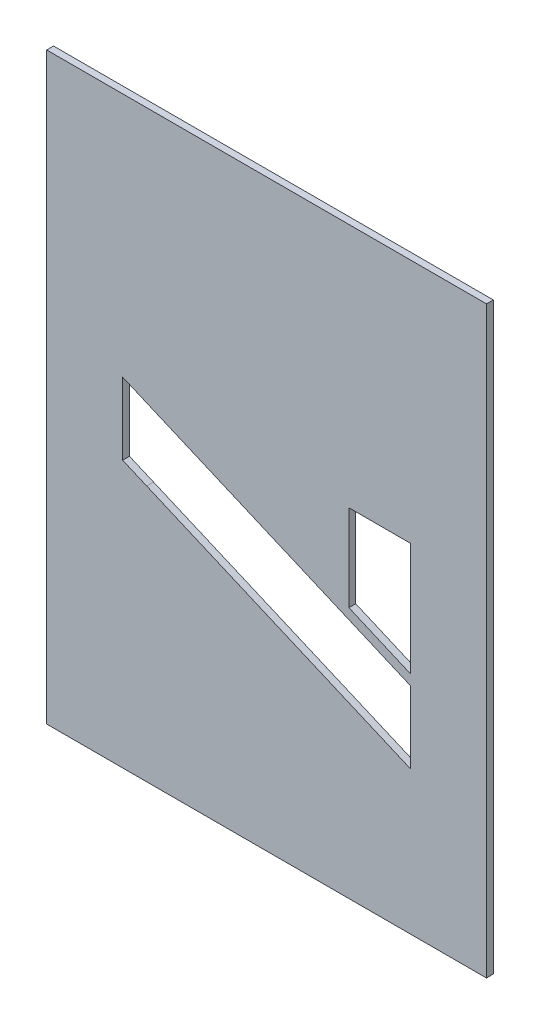
ISO-10303-21;
HEADER;
FILE_DESCRIPTION(('STEP AP214'),'2;1');
FILE_NAME('part.step','',(''),(''),'','','');
FILE_SCHEMA(('AUTOMOTIVE_DESIGN { 1 0 10303 214 1 1 1 1 }'));
ENDSEC;
DATA;
#1=APPLICATION_CONTEXT('core data for automotive mechanical design processes');
#2=APPLICATION_PROTOCOL_DEFINITION('international standard','automotive_design',2000,#1);
#3=PRODUCT_CONTEXT('',#1,'mechanical');
#4=PRODUCT('Part','Part','',(#3));
#5=PRODUCT_RELATED_PRODUCT_CATEGORY('part','',(#4));
#6=PRODUCT_DEFINITION_FORMATION('','',#4);
#7=PRODUCT_DEFINITION_CONTEXT('part definition',#1,'design');
#8=PRODUCT_DEFINITION('design','',#6,#7);
#9=PRODUCT_DEFINITION_SHAPE('','',#8);
#10=(LENGTH_UNIT() NAMED_UNIT(*) SI_UNIT(.MILLI.,.METRE.));
#11=(NAMED_UNIT(*) PLANE_ANGLE_UNIT() SI_UNIT($,.RADIAN.));
#12=(NAMED_UNIT(*) SI_UNIT($,.STERADIAN.) SOLID_ANGLE_UNIT());
#13=UNCERTAINTY_MEASURE_WITH_UNIT(LENGTH_MEASURE(1.E-05),#10,'distance_accuracy_value','');
#14=(GEOMETRIC_REPRESENTATION_CONTEXT(3) GLOBAL_UNCERTAINTY_ASSIGNED_CONTEXT((#13)) GLOBAL_UNIT_ASSIGNED_CONTEXT((#10,
#11,#12)) REPRESENTATION_CONTEXT('',''));
#15=CARTESIAN_POINT('',(0.,0.,0.));
#16=DIRECTION('',(0.,0.,1.));
#17=DIRECTION('',(1.,0.,0.));
#18=AXIS2_PLACEMENT_3D('',#15,#16,#17);
#19=CARTESIAN_POINT('',(-152.75,205.024999999999,-0.00999999999999959));
#20=DIRECTION('',(0.,-1.,0.));
#21=DIRECTION('',(1.,0.,0.));
#22=AXIS2_PLACEMENT_3D('',#19,#20,#21);
#23=PLANE('',#22);
#24=DIRECTION('',(0.,0.,-1.));
#25=VECTOR('',#24,1.);
#26=CARTESIAN_POINT('',(-152.75,205.024999999999,4.75));
#27=LINE('',#26,#25);
#28=CARTESIAN_POINT('',(-152.75,205.024999999999,4.75));
#29=VERTEX_POINT('',#28);
#30=CARTESIAN_POINT('',(-152.75,205.024999999999,0.));
#31=VERTEX_POINT('',#30);
#32=EDGE_CURVE('E162',#29,#31,#27,.T.);
#33=ORIENTED_EDGE('',*,*,#32,.T.);
#34=DIRECTION('',(1.,0.,0.));
#35=VECTOR('',#34,1.);
#36=CARTESIAN_POINT('',(0.,205.024999999999,0.));
#37=LINE('',#36,#35);
#38=CARTESIAN_POINT('',(152.75,205.024999999999,0.));
#39=VERTEX_POINT('',#38);
#40=EDGE_CURVE('E150',#31,#39,#37,.T.);
#41=ORIENTED_EDGE('',*,*,#40,.T.);
#42=DIRECTION('',(0.,0.,1.));
#43=VECTOR('',#42,1.);
#44=CARTESIAN_POINT('',(152.75,205.024999999999,4.75));
#45=LINE('',#44,#43);
#46=CARTESIAN_POINT('',(152.75,205.024999999999,4.75));
#47=VERTEX_POINT('',#46);
#48=EDGE_CURVE('E160',#39,#47,#45,.T.);
#49=ORIENTED_EDGE('',*,*,#48,.T.);
#50=DIRECTION('',(1.,0.,0.));
#51=VECTOR('',#50,1.);
#52=CARTESIAN_POINT('',(0.,205.024999999999,4.75));
#53=LINE('',#52,#51);
#54=EDGE_CURVE('E163',#29,#47,#53,.T.);
#55=ORIENTED_EDGE('',*,*,#54,.F.);
#56=EDGE_LOOP('',(#33,#41,#49,#55));
#57=FACE_BOUND('',#56,.T.);
#58=ADVANCED_FACE('F35',(#57),#23,.T.);
#59=CARTESIAN_POINT('',(0.,0.,4.75));
#60=DIRECTION('',(0.,0.,1.));
#61=DIRECTION('',(1.,0.,0.));
#62=AXIS2_PLACEMENT_3D('',#59,#60,#61);
#63=PLANE('',#62);
#64=DIRECTION('',(0.,-1.,0.));
#65=VECTOR('',#64,1.);
#66=CARTESIAN_POINT('',(100.025,440.126984126983,4.75));
#67=LINE('',#66,#65);
#68=CARTESIAN_POINT('',(100.025,440.126984126983,4.75));
#69=VERTEX_POINT('',#68);
#70=CARTESIAN_POINT('',(100.025,361.566137566137,4.75));
#71=VERTEX_POINT('',#70);
#72=EDGE_CURVE('E239',#69,#71,#67,.T.);
#73=ORIENTED_EDGE('',*,*,#72,.T.);
#74=DIRECTION('',(-0.918392323076319,0.395671000851062,0.));
#75=VECTOR('',#74,1.);
#76=CARTESIAN_POINT('',(100.025,361.566137566137,4.75));
#77=LINE('',#76,#75);
#78=CARTESIAN_POINT('',(57.1890211640211,380.021164021163,4.75));
#79=VERTEX_POINT('',#78);
#80=EDGE_CURVE('E11',#71,#79,#77,.T.);
#81=ORIENTED_EDGE('',*,*,#80,.T.);
#82=DIRECTION('',(0.,1.,0.));
#83=VECTOR('',#82,1.);
#84=CARTESIAN_POINT('',(57.1890211640211,380.021164021163,4.75));
#85=LINE('',#84,#83);
#86=CARTESIAN_POINT('',(57.1890211640211,440.126984126983,4.75));
#87=VERTEX_POINT('',#86);
#88=EDGE_CURVE('E45',#79,#87,#85,.T.);
#89=ORIENTED_EDGE('',*,*,#88,.T.);
#90=DIRECTION('',(1.,0.,0.));
#91=VECTOR('',#90,1.);
#92=CARTESIAN_POINT('',(57.1890211640211,440.126984126983,4.75));
#93=LINE('',#92,#91);
#94=EDGE_CURVE('E242',#87,#69,#93,.T.);
#95=ORIENTED_EDGE('',*,*,#94,.T.);
#96=EDGE_LOOP('',(#73,#81,#89,#95));
#97=FACE_BOUND('',#96,.T.);
#98=DIRECTION('',(0.919123069768513,-0.393970535217173,0.));
#99=VECTOR('',#98,1.);
#100=CARTESIAN_POINT('',(-99.9750000000001,440.126984126983,4.75));
#101=LINE('',#100,#99);
#102=CARTESIAN_POINT('',(-99.9750000000001,440.126984126983,4.75));
#103=VERTEX_POINT('',#102);
#104=CARTESIAN_POINT('',(83.3054232804232,361.566137566137,4.75));
#105=VERTEX_POINT('',#104);
#106=EDGE_CURVE('E200',#103,#105,#101,.T.);
#107=ORIENTED_EDGE('',*,*,#106,.T.);
#108=DIRECTION('',(0.91938564023369,-0.393357400505046,0.));
#109=VECTOR('',#108,1.);
#110=CARTESIAN_POINT('',(83.3054232804232,361.566137566137,4.75));
#111=LINE('',#110,#109);
#112=CARTESIAN_POINT('',(100.025,354.412698412697,4.75));
#113=VERTEX_POINT('',#112);
#114=EDGE_CURVE('E216',#105,#113,#111,.T.);
#115=ORIENTED_EDGE('',*,*,#114,.T.);
#116=DIRECTION('',(0.,-1.,0.));
#117=VECTOR('',#116,1.);
#118=CARTESIAN_POINT('',(100.025,354.412698412697,4.75));
#119=LINE('',#118,#117);
#120=CARTESIAN_POINT('',(100.025,304.423280423279,4.75));
#121=VERTEX_POINT('',#120);
#122=EDGE_CURVE('E213',#113,#121,#119,.T.);
#123=ORIENTED_EDGE('',*,*,#122,.T.);
#124=DIRECTION('',(-0.919123069768513,0.393970535217173,0.));
#125=VECTOR('',#124,1.);
#126=CARTESIAN_POINT('',(100.025,304.423280423279,4.75));
#127=LINE('',#126,#125);
#128=CARTESIAN_POINT('',(-83.2554232804233,382.984126984126,4.75));
#129=VERTEX_POINT('',#128);
#130=EDGE_CURVE('E210',#121,#129,#127,.T.);
#131=ORIENTED_EDGE('',*,*,#130,.T.);
#132=DIRECTION('',(-0.91938564023369,0.393357400505046,0.));
#133=VECTOR('',#132,1.);
#134=CARTESIAN_POINT('',(-83.2554232804233,382.984126984126,4.75));
#135=LINE('',#134,#133);
#136=CARTESIAN_POINT('',(-99.9750000000001,390.137566137565,4.75));
#137=VERTEX_POINT('',#136);
#138=EDGE_CURVE('E207',#129,#137,#135,.T.);
#139=ORIENTED_EDGE('',*,*,#138,.T.);
#140=DIRECTION('',(0.,1.,0.));
#141=VECTOR('',#140,1.);
#142=CARTESIAN_POINT('',(-99.9750000000001,390.137566137565,4.75));
#143=LINE('',#142,#141);
#144=EDGE_CURVE('E203',#137,#103,#143,.T.);
#145=ORIENTED_EDGE('',*,*,#144,.T.);
#146=EDGE_LOOP('',(#107,#115,#123,#131,#139,#145));
#147=FACE_BOUND('',#146,.T.);
#148=DIRECTION('',(0.,-1.,0.));
#149=VECTOR('',#148,1.);
#150=CARTESIAN_POINT('',(-152.75,-610.575000000001,4.75));
#151=LINE('',#150,#149);
#152=CARTESIAN_POINT('',(-152.75,610.574999999999,4.75));
#153=VERTEX_POINT('',#152);
#154=EDGE_CURVE('E172',#153,#29,#151,.T.);
#155=ORIENTED_EDGE('',*,*,#154,.T.);
#156=ORIENTED_EDGE('',*,*,#54,.T.);
#157=DIRECTION('',(0.,1.,0.));
#158=VECTOR('',#157,1.);
#159=CARTESIAN_POINT('',(152.75,-610.575000000001,4.75));
#160=LINE('',#159,#158);
#161=CARTESIAN_POINT('',(152.75,610.574999999999,4.75));
#162=VERTEX_POINT('',#161);
#163=EDGE_CURVE('E166',#47,#162,#160,.T.);
#164=ORIENTED_EDGE('',*,*,#163,.T.);
#165=DIRECTION('',(-1.,0.,0.));
#166=VECTOR('',#165,1.);
#167=CARTESIAN_POINT('',(152.75,610.574999999999,4.75));
#168=LINE('',#167,#166);
#169=EDGE_CURVE('E173',#162,#153,#168,.T.);
#170=ORIENTED_EDGE('',*,*,#169,.T.);
#171=EDGE_LOOP('',(#155,#156,#164,#170));
#172=FACE_BOUND('',#171,.T.);
#173=ADVANCED_FACE('F255',(#97,#147,#172),#63,.T.);
#174=CARTESIAN_POINT('',(0.,0.,0.));
#175=DIRECTION('',(0.,0.,1.));
#176=DIRECTION('',(1.,0.,0.));
#177=AXIS2_PLACEMENT_3D('',#174,#175,#176);
#178=PLANE('',#177);
#179=DIRECTION('',(0.91938564023369,-0.393357400505046,0.));
#180=VECTOR('',#179,1.);
#181=CARTESIAN_POINT('',(83.3054232804232,361.566137566137,0.));
#182=LINE('',#181,#180);
#183=CARTESIAN_POINT('',(83.3054232804232,361.566137566137,0.));
#184=VERTEX_POINT('',#183);
#185=CARTESIAN_POINT('',(100.025,354.412698412697,0.));
#186=VERTEX_POINT('',#185);
#187=EDGE_CURVE('E204',#184,#186,#182,.T.);
#188=ORIENTED_EDGE('',*,*,#187,.F.);
#189=DIRECTION('',(0.919123069768513,-0.393970535217173,0.));
#190=VECTOR('',#189,1.);
#191=CARTESIAN_POINT('',(-99.9750000000001,440.126984126983,0.));
#192=LINE('',#191,#190);
#193=CARTESIAN_POINT('',(-99.9750000000001,440.126984126983,0.));
#194=VERTEX_POINT('',#193);
#195=EDGE_CURVE('E199',#194,#184,#192,.T.);
#196=ORIENTED_EDGE('',*,*,#195,.F.);
#197=DIRECTION('',(0.,1.,0.));
#198=VECTOR('',#197,1.);
#199=CARTESIAN_POINT('',(-99.9750000000001,390.137566137565,0.));
#200=LINE('',#199,#198);
#201=CARTESIAN_POINT('',(-99.9750000000001,390.137566137565,0.));
#202=VERTEX_POINT('',#201);
#203=EDGE_CURVE('E221',#202,#194,#200,.T.);
#204=ORIENTED_EDGE('',*,*,#203,.F.);
#205=DIRECTION('',(-0.91938564023369,0.393357400505046,0.));
#206=VECTOR('',#205,1.);
#207=CARTESIAN_POINT('',(-83.2554232804233,382.984126984126,0.));
#208=LINE('',#207,#206);
#209=CARTESIAN_POINT('',(-83.2554232804233,382.984126984126,0.));
#210=VERTEX_POINT('',#209);
#211=EDGE_CURVE('E224',#210,#202,#208,.T.);
#212=ORIENTED_EDGE('',*,*,#211,.F.);
#213=DIRECTION('',(-0.919123069768513,0.393970535217173,0.));
#214=VECTOR('',#213,1.);
#215=CARTESIAN_POINT('',(100.025,304.423280423279,0.));
#216=LINE('',#215,#214);
#217=CARTESIAN_POINT('',(100.025,304.423280423279,0.));
#218=VERTEX_POINT('',#217);
#219=EDGE_CURVE('E226',#218,#210,#216,.T.);
#220=ORIENTED_EDGE('',*,*,#219,.F.);
#221=DIRECTION('',(0.,-1.,0.));
#222=VECTOR('',#221,1.);
#223=CARTESIAN_POINT('',(100.025,354.412698412697,0.));
#224=LINE('',#223,#222);
#225=EDGE_CURVE('E228',#186,#218,#224,.T.);
#226=ORIENTED_EDGE('',*,*,#225,.F.);
#227=EDGE_LOOP('',(#188,#196,#204,#212,#220,#226));
#228=FACE_BOUND('',#227,.T.);
#229=DIRECTION('',(-0.918392323076319,0.395671000851062,0.));
#230=VECTOR('',#229,1.);
#231=CARTESIAN_POINT('',(100.025,361.566137566137,0.));
#232=LINE('',#231,#230);
#233=CARTESIAN_POINT('',(100.025,361.566137566137,0.));
#234=VERTEX_POINT('',#233);
#235=CARTESIAN_POINT('',(57.1890211640211,380.021164021163,0.));
#236=VERTEX_POINT('',#235);
#237=EDGE_CURVE('E71',#234,#236,#232,.T.);
#238=ORIENTED_EDGE('',*,*,#237,.F.);
#239=DIRECTION('',(0.,-1.,0.));
#240=VECTOR('',#239,1.);
#241=CARTESIAN_POINT('',(100.025,440.126984126983,0.));
#242=LINE('',#241,#240);
#243=CARTESIAN_POINT('',(100.025,440.126984126983,0.));
#244=VERTEX_POINT('',#243);
#245=EDGE_CURVE('E238',#244,#234,#242,.T.);
#246=ORIENTED_EDGE('',*,*,#245,.F.);
#247=DIRECTION('',(1.,0.,0.));
#248=VECTOR('',#247,1.);
#249=CARTESIAN_POINT('',(57.1890211640211,440.126984126983,0.));
#250=LINE('',#249,#248);
#251=CARTESIAN_POINT('',(57.1890211640211,440.126984126983,0.));
#252=VERTEX_POINT('',#251);
#253=EDGE_CURVE('E247',#252,#244,#250,.T.);
#254=ORIENTED_EDGE('',*,*,#253,.F.);
#255=DIRECTION('',(0.,1.,0.));
#256=VECTOR('',#255,1.);
#257=CARTESIAN_POINT('',(57.1890211640211,380.021164021163,0.));
#258=LINE('',#257,#256);
#259=EDGE_CURVE('E65',#236,#252,#258,.T.);
#260=ORIENTED_EDGE('',*,*,#259,.F.);
#261=EDGE_LOOP('',(#238,#246,#254,#260));
#262=FACE_BOUND('',#261,.T.);
#263=ORIENTED_EDGE('',*,*,#40,.F.);
#264=DIRECTION('',(0.,-1.,0.));
#265=VECTOR('',#264,1.);
#266=CARTESIAN_POINT('',(-152.75,-610.575000000001,0.));
#267=LINE('',#266,#265);
#268=CARTESIAN_POINT('',(-152.75,610.574999999999,0.));
#269=VERTEX_POINT('',#268);
#270=EDGE_CURVE('E39',#269,#31,#267,.T.);
#271=ORIENTED_EDGE('',*,*,#270,.F.);
#272=DIRECTION('',(-1.,0.,0.));
#273=VECTOR('',#272,1.);
#274=CARTESIAN_POINT('',(152.75,610.574999999999,0.));
#275=LINE('',#274,#273);
#276=CARTESIAN_POINT('',(152.75,610.574999999999,0.));
#277=VERTEX_POINT('',#276);
#278=EDGE_CURVE('E152',#277,#269,#275,.T.);
#279=ORIENTED_EDGE('',*,*,#278,.F.);
#280=DIRECTION('',(0.,1.,0.));
#281=VECTOR('',#280,1.);
#282=CARTESIAN_POINT('',(152.75,-610.575000000001,0.));
#283=LINE('',#282,#281);
#284=EDGE_CURVE('E146',#39,#277,#283,.T.);
#285=ORIENTED_EDGE('',*,*,#284,.F.);
#286=EDGE_LOOP('',(#263,#271,#279,#285));
#287=FACE_BOUND('',#286,.T.);
#288=ADVANCED_FACE('F148',(#228,#262,#287),#178,.F.);
#289=CARTESIAN_POINT('',(-152.75,-610.575000000001,4.75));
#290=DIRECTION('',(1.,0.,0.));
#291=DIRECTION('',(0.,0.,-1.));
#292=AXIS2_PLACEMENT_3D('',#289,#290,#291);
#293=PLANE('',#292);
#294=ORIENTED_EDGE('',*,*,#32,.F.);
#295=ORIENTED_EDGE('',*,*,#154,.F.);
#296=DIRECTION('',(0.,0.,-1.));
#297=VECTOR('',#296,1.);
#298=CARTESIAN_POINT('',(-152.75,610.574999999999,4.75));
#299=LINE('',#298,#297);
#300=EDGE_CURVE('E182',#153,#269,#299,.T.);
#301=ORIENTED_EDGE('',*,*,#300,.T.);
#302=ORIENTED_EDGE('',*,*,#270,.T.);
#303=EDGE_LOOP('',(#294,#295,#301,#302));
#304=FACE_BOUND('',#303,.T.);
#305=ADVANCED_FACE('F37',(#304),#293,.F.);
#306=CARTESIAN_POINT('',(152.75,-610.575000000001,4.75));
#307=DIRECTION('',(-1.,0.,0.));
#308=DIRECTION('',(0.,0.,1.));
#309=AXIS2_PLACEMENT_3D('',#306,#307,#308);
#310=PLANE('',#309);
#311=ORIENTED_EDGE('',*,*,#48,.F.);
#312=ORIENTED_EDGE('',*,*,#284,.T.);
#313=DIRECTION('',(0.,0.,-1.));
#314=VECTOR('',#313,1.);
#315=CARTESIAN_POINT('',(152.75,610.574999999999,4.75));
#316=LINE('',#315,#314);
#317=EDGE_CURVE('E251',#162,#277,#316,.T.);
#318=ORIENTED_EDGE('',*,*,#317,.F.);
#319=ORIENTED_EDGE('',*,*,#163,.F.);
#320=EDGE_LOOP('',(#311,#312,#318,#319));
#321=FACE_BOUND('',#320,.T.);
#322=ADVANCED_FACE('F165',(#321),#310,.F.);
#323=CARTESIAN_POINT('',(152.75,610.574999999999,4.75));
#324=DIRECTION('',(0.,-1.,0.));
#325=DIRECTION('',(1.,0.,0.));
#326=AXIS2_PLACEMENT_3D('',#323,#324,#325);
#327=PLANE('',#326);
#328=ORIENTED_EDGE('',*,*,#278,.T.);
#329=ORIENTED_EDGE('',*,*,#300,.F.);
#330=ORIENTED_EDGE('',*,*,#169,.F.);
#331=ORIENTED_EDGE('',*,*,#317,.T.);
#332=EDGE_LOOP('',(#328,#329,#330,#331));
#333=FACE_BOUND('',#332,.T.);
#334=ADVANCED_FACE('F254',(#333),#327,.F.);
#335=CARTESIAN_POINT('',(83.3054232804232,361.566137566137,0.));
#336=DIRECTION('',(-0.393357400505046,-0.91938564023369,0.));
#337=DIRECTION('',(0.91938564023369,-0.393357400505046,0.));
#338=AXIS2_PLACEMENT_3D('',#335,#336,#337);
#339=PLANE('',#338);
#340=ORIENTED_EDGE('',*,*,#114,.F.);
#341=DIRECTION('',(0.,0.,1.));
#342=VECTOR('',#341,1.);
#343=CARTESIAN_POINT('',(83.3054232804232,361.566137566137,0.));
#344=LINE('',#343,#342);
#345=EDGE_CURVE('E196',#184,#105,#344,.T.);
#346=ORIENTED_EDGE('',*,*,#345,.F.);
#347=ORIENTED_EDGE('',*,*,#187,.T.);
#348=DIRECTION('',(0.,0.,1.));
#349=VECTOR('',#348,1.);
#350=CARTESIAN_POINT('',(100.025,354.412698412697,0.));
#351=LINE('',#350,#349);
#352=EDGE_CURVE('E185',#186,#113,#351,.T.);
#353=ORIENTED_EDGE('',*,*,#352,.T.);
#354=EDGE_LOOP('',(#340,#346,#347,#353));
#355=FACE_BOUND('',#354,.T.);
#356=ADVANCED_FACE('F274',(#355),#339,.T.);
#357=CARTESIAN_POINT('',(100.025,354.412698412697,0.));
#358=DIRECTION('',(-1.,0.,0.));
#359=DIRECTION('',(0.,0.,1.));
#360=AXIS2_PLACEMENT_3D('',#357,#358,#359);
#361=PLANE('',#360);
#362=ORIENTED_EDGE('',*,*,#122,.F.);
#363=ORIENTED_EDGE('',*,*,#352,.F.);
#364=ORIENTED_EDGE('',*,*,#225,.T.);
#365=DIRECTION('',(0.,0.,1.));
#366=VECTOR('',#365,1.);
#367=CARTESIAN_POINT('',(100.025,304.423280423279,0.));
#368=LINE('',#367,#366);
#369=EDGE_CURVE('E188',#218,#121,#368,.T.);
#370=ORIENTED_EDGE('',*,*,#369,.T.);
#371=EDGE_LOOP('',(#362,#363,#364,#370));
#372=FACE_BOUND('',#371,.T.);
#373=ADVANCED_FACE('F361',(#372),#361,.T.);
#374=CARTESIAN_POINT('',(100.025,304.423280423279,0.));
#375=DIRECTION('',(0.393970535217173,0.919123069768513,0.));
#376=DIRECTION('',(-0.919123069768513,0.393970535217173,0.));
#377=AXIS2_PLACEMENT_3D('',#374,#375,#376);
#378=PLANE('',#377);
#379=ORIENTED_EDGE('',*,*,#130,.F.);
#380=ORIENTED_EDGE('',*,*,#369,.F.);
#381=ORIENTED_EDGE('',*,*,#219,.T.);
#382=DIRECTION('',(0.,0.,1.));
#383=VECTOR('',#382,1.);
#384=CARTESIAN_POINT('',(-83.2554232804233,382.984126984126,0.));
#385=LINE('',#384,#383);
#386=EDGE_CURVE('E190',#210,#129,#385,.T.);
#387=ORIENTED_EDGE('',*,*,#386,.T.);
#388=EDGE_LOOP('',(#379,#380,#381,#387));
#389=FACE_BOUND('',#388,.T.);
#390=ADVANCED_FACE('F352',(#389),#378,.T.);
#391=CARTESIAN_POINT('',(-83.2554232804233,382.984126984126,0.));
#392=DIRECTION('',(0.393357400505046,0.91938564023369,0.));
#393=DIRECTION('',(-0.91938564023369,0.393357400505046,0.));
#394=AXIS2_PLACEMENT_3D('',#391,#392,#393);
#395=PLANE('',#394);
#396=ORIENTED_EDGE('',*,*,#138,.F.);
#397=ORIENTED_EDGE('',*,*,#386,.F.);
#398=ORIENTED_EDGE('',*,*,#211,.T.);
#399=DIRECTION('',(0.,0.,1.));
#400=VECTOR('',#399,1.);
#401=CARTESIAN_POINT('',(-99.9750000000001,390.137566137565,0.));
#402=LINE('',#401,#400);
#403=EDGE_CURVE('E192',#202,#137,#402,.T.);
#404=ORIENTED_EDGE('',*,*,#403,.T.);
#405=EDGE_LOOP('',(#396,#397,#398,#404));
#406=FACE_BOUND('',#405,.T.);
#407=ADVANCED_FACE('F343',(#406),#395,.T.);
#408=CARTESIAN_POINT('',(-99.9750000000001,390.137566137565,0.));
#409=DIRECTION('',(1.,0.,0.));
#410=DIRECTION('',(0.,0.,-1.));
#411=AXIS2_PLACEMENT_3D('',#408,#409,#410);
#412=PLANE('',#411);
#413=ORIENTED_EDGE('',*,*,#144,.F.);
#414=ORIENTED_EDGE('',*,*,#403,.F.);
#415=ORIENTED_EDGE('',*,*,#203,.T.);
#416=DIRECTION('',(0.,0.,1.));
#417=VECTOR('',#416,1.);
#418=CARTESIAN_POINT('',(-99.9750000000001,440.126984126983,0.));
#419=LINE('',#418,#417);
#420=EDGE_CURVE('E194',#194,#103,#419,.T.);
#421=ORIENTED_EDGE('',*,*,#420,.T.);
#422=EDGE_LOOP('',(#413,#414,#415,#421));
#423=FACE_BOUND('',#422,.T.);
#424=ADVANCED_FACE('F334',(#423),#412,.T.);
#425=CARTESIAN_POINT('',(-99.9750000000001,440.126984126983,0.));
#426=DIRECTION('',(-0.393970535217173,-0.919123069768513,0.));
#427=DIRECTION('',(0.919123069768513,-0.393970535217173,0.));
#428=AXIS2_PLACEMENT_3D('',#425,#426,#427);
#429=PLANE('',#428);
#430=ORIENTED_EDGE('',*,*,#106,.F.);
#431=ORIENTED_EDGE('',*,*,#420,.F.);
#432=ORIENTED_EDGE('',*,*,#195,.T.);
#433=ORIENTED_EDGE('',*,*,#345,.T.);
#434=EDGE_LOOP('',(#430,#431,#432,#433));
#435=FACE_BOUND('',#434,.T.);
#436=ADVANCED_FACE('F326',(#435),#429,.T.);
#437=CARTESIAN_POINT('',(100.025,361.566137566137,0.));
#438=DIRECTION('',(0.395671000851062,0.918392323076319,0.));
#439=DIRECTION('',(-0.91839232307632,0.395671000851062,0.));
#440=AXIS2_PLACEMENT_3D('',#437,#438,#439);
#441=PLANE('',#440);
#442=ORIENTED_EDGE('',*,*,#80,.F.);
#443=DIRECTION('',(0.,0.,1.));
#444=VECTOR('',#443,1.);
#445=CARTESIAN_POINT('',(100.025,361.566137566137,0.));
#446=LINE('',#445,#444);
#447=EDGE_CURVE('E235',#234,#71,#446,.T.);
#448=ORIENTED_EDGE('',*,*,#447,.F.);
#449=ORIENTED_EDGE('',*,*,#237,.T.);
#450=DIRECTION('',(0.,0.,1.));
#451=VECTOR('',#450,1.);
#452=CARTESIAN_POINT('',(57.1890211640211,380.021164021163,0.));
#453=LINE('',#452,#451);
#454=EDGE_CURVE('E219',#236,#79,#453,.T.);
#455=ORIENTED_EDGE('',*,*,#454,.T.);
#456=EDGE_LOOP('',(#442,#448,#449,#455));
#457=FACE_BOUND('',#456,.T.);
#458=ADVANCED_FACE('F318',(#457),#441,.T.);
#459=CARTESIAN_POINT('',(57.1890211640211,380.021164021163,0.));
#460=DIRECTION('',(1.,0.,0.));
#461=DIRECTION('',(0.,0.,-1.));
#462=AXIS2_PLACEMENT_3D('',#459,#460,#461);
#463=PLANE('',#462);
#464=ORIENTED_EDGE('',*,*,#88,.F.);
#465=ORIENTED_EDGE('',*,*,#454,.F.);
#466=ORIENTED_EDGE('',*,*,#259,.T.);
#467=DIRECTION('',(0.,0.,1.));
#468=VECTOR('',#467,1.);
#469=CARTESIAN_POINT('',(57.1890211640211,440.126984126983,0.));
#470=LINE('',#469,#468);
#471=EDGE_CURVE('E232',#252,#87,#470,.T.);
#472=ORIENTED_EDGE('',*,*,#471,.T.);
#473=EDGE_LOOP('',(#464,#465,#466,#472));
#474=FACE_BOUND('',#473,.T.);
#475=ADVANCED_FACE('F310',(#474),#463,.T.);
#476=CARTESIAN_POINT('',(57.1890211640211,440.126984126983,0.));
#477=DIRECTION('',(0.,-1.,0.));
#478=DIRECTION('',(0.,0.,-1.));
#479=AXIS2_PLACEMENT_3D('',#476,#477,#478);
#480=PLANE('',#479);
#481=ORIENTED_EDGE('',*,*,#94,.F.);
#482=ORIENTED_EDGE('',*,*,#471,.F.);
#483=ORIENTED_EDGE('',*,*,#253,.T.);
#484=DIRECTION('',(0.,0.,1.));
#485=VECTOR('',#484,1.);
#486=CARTESIAN_POINT('',(100.025,440.126984126983,0.));
#487=LINE('',#486,#485);
#488=EDGE_CURVE('E77',#244,#69,#487,.T.);
#489=ORIENTED_EDGE('',*,*,#488,.T.);
#490=EDGE_LOOP('',(#481,#482,#483,#489));
#491=FACE_BOUND('',#490,.T.);
#492=ADVANCED_FACE('F302',(#491),#480,.T.);
#493=CARTESIAN_POINT('',(100.025,440.126984126983,0.));
#494=DIRECTION('',(-1.,0.,0.));
#495=DIRECTION('',(0.,0.,1.));
#496=AXIS2_PLACEMENT_3D('',#493,#494,#495);
#497=PLANE('',#496);
#498=ORIENTED_EDGE('',*,*,#72,.F.);
#499=ORIENTED_EDGE('',*,*,#488,.F.);
#500=ORIENTED_EDGE('',*,*,#245,.T.);
#501=ORIENTED_EDGE('',*,*,#447,.T.);
#502=EDGE_LOOP('',(#498,#499,#500,#501));
#503=FACE_BOUND('',#502,.T.);
#504=ADVANCED_FACE('F266',(#503),#497,.T.);
#505=CLOSED_SHELL('',(#58,#173,#288,#305,#322,#334,#356,#373,#390,#407,#424,#436,#458,#475,#492,#504));
#506=MANIFOLD_SOLID_BREP('B2',#505);
#507=ADVANCED_BREP_SHAPE_REPRESENTATION('',(#18,#506),#14);
#508=SHAPE_DEFINITION_REPRESENTATION(#9,#507);
ENDSEC;
END-ISO-10303-21;
